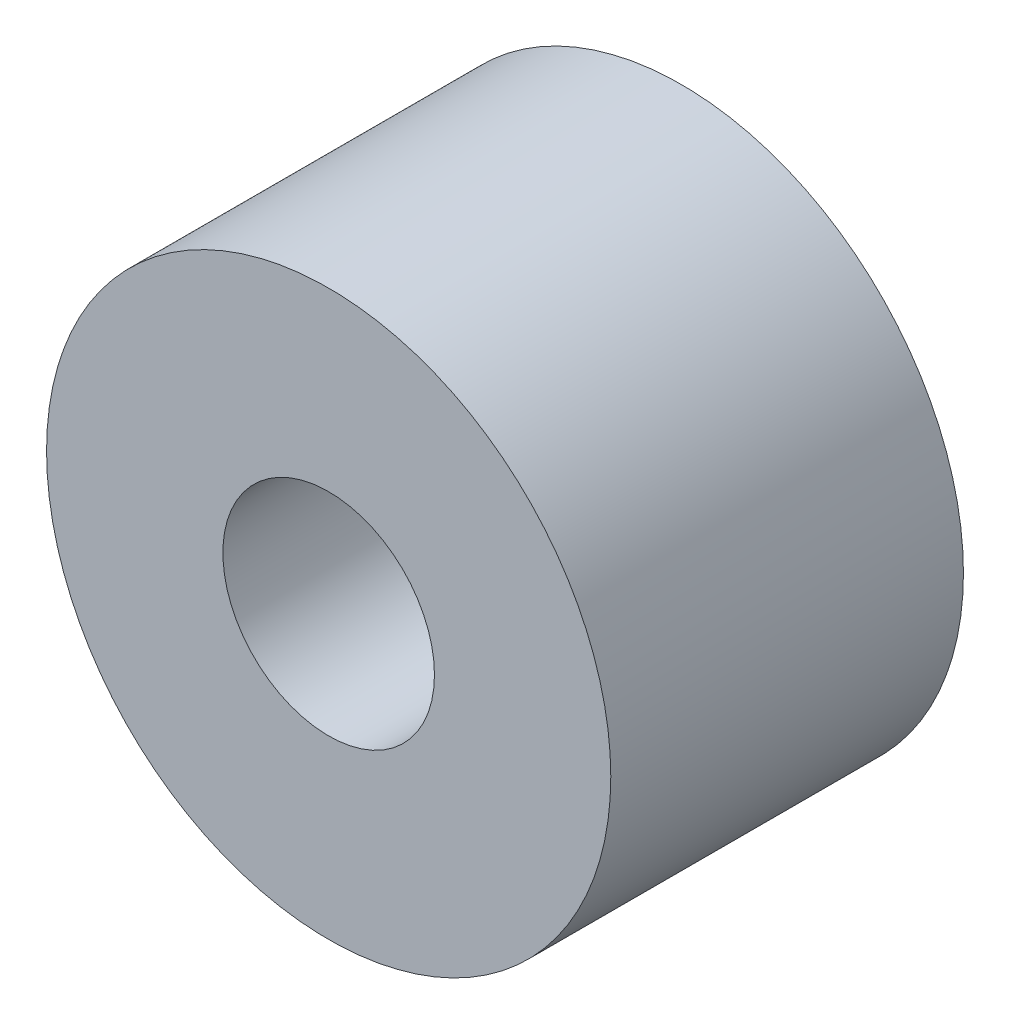
ISO-10303-21;
HEADER;
FILE_DESCRIPTION(('STEP AP214'),'2;1');
FILE_NAME('part.step','',(''),(''),'','','');
FILE_SCHEMA(('AUTOMOTIVE_DESIGN { 1 0 10303 214 1 1 1 1 }'));
ENDSEC;
DATA;
#1=APPLICATION_CONTEXT('core data for automotive mechanical design processes');
#2=APPLICATION_PROTOCOL_DEFINITION('international standard','automotive_design',2000,#1);
#3=PRODUCT_CONTEXT('',#1,'mechanical');
#4=PRODUCT('Part','Part','',(#3));
#5=PRODUCT_RELATED_PRODUCT_CATEGORY('part','',(#4));
#6=PRODUCT_DEFINITION_FORMATION('','',#4);
#7=PRODUCT_DEFINITION_CONTEXT('part definition',#1,'design');
#8=PRODUCT_DEFINITION('design','',#6,#7);
#9=PRODUCT_DEFINITION_SHAPE('','',#8);
#10=(LENGTH_UNIT() NAMED_UNIT(*) SI_UNIT(.MILLI.,.METRE.));
#11=(NAMED_UNIT(*) PLANE_ANGLE_UNIT() SI_UNIT($,.RADIAN.));
#12=(NAMED_UNIT(*) SI_UNIT($,.STERADIAN.) SOLID_ANGLE_UNIT());
#13=UNCERTAINTY_MEASURE_WITH_UNIT(LENGTH_MEASURE(1.E-05),#10,'distance_accuracy_value','');
#14=(GEOMETRIC_REPRESENTATION_CONTEXT(3) GLOBAL_UNCERTAINTY_ASSIGNED_CONTEXT((#13)) GLOBAL_UNIT_ASSIGNED_CONTEXT((#10,
#11,#12)) REPRESENTATION_CONTEXT('',''));
#15=CARTESIAN_POINT('',(0.,0.,0.));
#16=DIRECTION('',(0.,0.,1.));
#17=DIRECTION('',(1.,0.,0.));
#18=AXIS2_PLACEMENT_3D('',#15,#16,#17);
#19=CARTESIAN_POINT('',(0.,0.,5.));
#20=DIRECTION('',(0.,0.,1.));
#21=DIRECTION('',(1.,0.,0.));
#22=AXIS2_PLACEMENT_3D('',#19,#20,#21);
#23=PLANE('',#22);
#24=CARTESIAN_POINT('',(0.,0.,5.));
#25=DIRECTION('',(0.,0.,1.));
#26=DIRECTION('',(1.,0.,0.));
#27=AXIS2_PLACEMENT_3D('',#24,#25,#26);
#28=CIRCLE('',#27,4.);
#29=CARTESIAN_POINT('',(4.,0.,5.));
#30=VERTEX_POINT('',#29);
#31=EDGE_CURVE('E10',#30,#30,#28,.T.);
#32=ORIENTED_EDGE('',*,*,#31,.T.);
#33=EDGE_LOOP('',(#32));
#34=FACE_BOUND('',#33,.T.);
#35=CARTESIAN_POINT('',(0.,0.,5.));
#36=DIRECTION('',(0.,0.,1.));
#37=DIRECTION('',(1.,0.,0.));
#38=AXIS2_PLACEMENT_3D('',#35,#36,#37);
#39=CIRCLE('',#38,1.5);
#40=CARTESIAN_POINT('',(1.5,0.,5.));
#41=VERTEX_POINT('',#40);
#42=EDGE_CURVE('E42',#41,#41,#39,.T.);
#43=ORIENTED_EDGE('',*,*,#42,.F.);
#44=EDGE_LOOP('',(#43));
#45=FACE_BOUND('',#44,.T.);
#46=ADVANCED_FACE('F31',(#34,#45),#23,.T.);
#47=CARTESIAN_POINT('',(0.,0.,0.));
#48=DIRECTION('',(0.,0.,1.));
#49=DIRECTION('',(1.,0.,0.));
#50=AXIS2_PLACEMENT_3D('',#47,#48,#49);
#51=PLANE('',#50);
#52=CARTESIAN_POINT('',(0.,0.,0.));
#53=DIRECTION('',(0.,0.,1.));
#54=DIRECTION('',(1.,0.,0.));
#55=AXIS2_PLACEMENT_3D('',#52,#53,#54);
#56=CIRCLE('',#55,4.);
#57=CARTESIAN_POINT('',(4.,0.,0.));
#58=VERTEX_POINT('',#57);
#59=EDGE_CURVE('E35',#58,#58,#56,.T.);
#60=ORIENTED_EDGE('',*,*,#59,.F.);
#61=EDGE_LOOP('',(#60));
#62=FACE_BOUND('',#61,.T.);
#63=CARTESIAN_POINT('',(0.,0.,0.));
#64=DIRECTION('',(0.,0.,1.));
#65=DIRECTION('',(1.,0.,0.));
#66=AXIS2_PLACEMENT_3D('',#63,#64,#65);
#67=CIRCLE('',#66,1.5);
#68=CARTESIAN_POINT('',(1.5,0.,0.));
#69=VERTEX_POINT('',#68);
#70=EDGE_CURVE('E44',#69,#69,#67,.T.);
#71=ORIENTED_EDGE('',*,*,#70,.T.);
#72=EDGE_LOOP('',(#71));
#73=FACE_BOUND('',#72,.T.);
#74=ADVANCED_FACE('F54',(#62,#73),#51,.F.);
#75=CARTESIAN_POINT('',(0.,0.,5.));
#76=DIRECTION('',(0.,0.,-1.));
#77=DIRECTION('',(-1.,0.,0.));
#78=AXIS2_PLACEMENT_3D('',#75,#76,#77);
#79=CYLINDRICAL_SURFACE('',#78,4.);
#80=ORIENTED_EDGE('',*,*,#31,.F.);
#81=EDGE_LOOP('',(#80));
#82=FACE_BOUND('',#81,.T.);
#83=ORIENTED_EDGE('',*,*,#59,.T.);
#84=EDGE_LOOP('',(#83));
#85=FACE_BOUND('',#84,.T.);
#86=ADVANCED_FACE('F33',(#82,#85),#79,.T.);
#87=CARTESIAN_POINT('',(0.,0.,5.));
#88=DIRECTION('',(0.,0.,-1.));
#89=DIRECTION('',(-1.,0.,0.));
#90=AXIS2_PLACEMENT_3D('',#87,#88,#89);
#91=CYLINDRICAL_SURFACE('',#90,1.5);
#92=ORIENTED_EDGE('',*,*,#42,.T.);
#93=EDGE_LOOP('',(#92));
#94=FACE_BOUND('',#93,.T.);
#95=ORIENTED_EDGE('',*,*,#70,.F.);
#96=EDGE_LOOP('',(#95));
#97=FACE_BOUND('',#96,.T.);
#98=ADVANCED_FACE('F50',(#94,#97),#91,.F.);
#99=CLOSED_SHELL('',(#46,#74,#86,#98));
#100=MANIFOLD_SOLID_BREP('B2',#99);
#101=ADVANCED_BREP_SHAPE_REPRESENTATION('',(#18,#100),#14);
#102=SHAPE_DEFINITION_REPRESENTATION(#9,#101);
ENDSEC;
END-ISO-10303-21;
